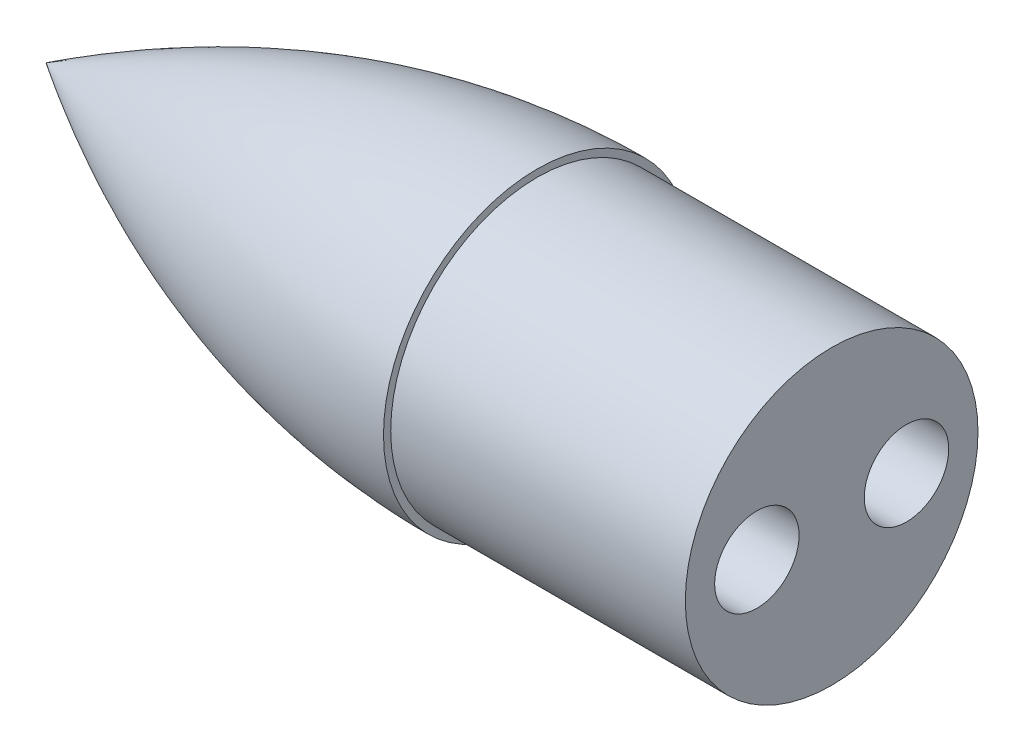
ISO-10303-21;
HEADER;
FILE_DESCRIPTION(('STEP AP214'),'2;1');
FILE_NAME('part.step','',(''),(''),'','','');
FILE_SCHEMA(('AUTOMOTIVE_DESIGN { 1 0 10303 214 1 1 1 1 }'));
ENDSEC;
DATA;
#1=APPLICATION_CONTEXT('core data for automotive mechanical design processes');
#2=APPLICATION_PROTOCOL_DEFINITION('international standard','automotive_design',2000,#1);
#3=PRODUCT_CONTEXT('',#1,'mechanical');
#4=PRODUCT('Part','Part','',(#3));
#5=PRODUCT_RELATED_PRODUCT_CATEGORY('part','',(#4));
#6=PRODUCT_DEFINITION_FORMATION('','',#4);
#7=PRODUCT_DEFINITION_CONTEXT('part definition',#1,'design');
#8=PRODUCT_DEFINITION('design','',#6,#7);
#9=PRODUCT_DEFINITION_SHAPE('','',#8);
#10=(LENGTH_UNIT() NAMED_UNIT(*) SI_UNIT(.MILLI.,.METRE.));
#11=(NAMED_UNIT(*) PLANE_ANGLE_UNIT() SI_UNIT($,.RADIAN.));
#12=(NAMED_UNIT(*) SI_UNIT($,.STERADIAN.) SOLID_ANGLE_UNIT());
#13=UNCERTAINTY_MEASURE_WITH_UNIT(LENGTH_MEASURE(1.E-05),#10,'distance_accuracy_value','');
#14=(GEOMETRIC_REPRESENTATION_CONTEXT(3) GLOBAL_UNCERTAINTY_ASSIGNED_CONTEXT((#13)) GLOBAL_UNIT_ASSIGNED_CONTEXT((#10,
#11,#12)) REPRESENTATION_CONTEXT('',''));
#15=CARTESIAN_POINT('',(0.,0.,0.));
#16=DIRECTION('',(0.,0.,1.));
#17=DIRECTION('',(1.,0.,0.));
#18=AXIS2_PLACEMENT_3D('',#15,#16,#17);
#19=CARTESIAN_POINT('',(126.999999998147,39.7129000005503,0.));
#20=CARTESIAN_POINT('',(63.4999999986337,39.7128999996959,0.));
#21=CARTESIAN_POINT('',(-8.80002667957847E-10,-5.50345793243201E-10,0.));
#22=B_SPLINE_CURVE_WITH_KNOTS('',2,(#19,#20,#21),.UNSPECIFIED.,.F.,.F.,(3,3),
(0.0748794844436661,0.91589813493239),.UNSPECIFIED.);
#23=CARTESIAN_POINT('',(-7.0399762408524E-10,-4.40280190777687E-10,0.));
#24=DIRECTION('',(-1.,0.,0.));
#25=AXIS1_PLACEMENT('',#23,#24);
#26=SURFACE_OF_REVOLUTION('',#22,#25);
#27=CARTESIAN_POINT('',(-7.0399762408524E-10,-4.40280190777687E-10,0.));
#28=VERTEX_POINT('',#27);
#29=VERTEX_LOOP('',#28);
#30=FACE_BOUND('',#29,.T.);
#31=CARTESIAN_POINT('',(126.999999998421,-4.40280190777687E-10,0.));
#32=DIRECTION('',(-1.,0.,0.));
#33=DIRECTION('',(0.,0.,1.));
#34=AXIS2_PLACEMENT_3D('',#31,#32,#33);
#35=CIRCLE('',#34,39.7129000009906);
#36=CARTESIAN_POINT('',(126.999999998421,-4.40280190777687E-10,39.7129000009906));
#37=VERTEX_POINT('',#36);
#38=EDGE_CURVE('E56',#37,#37,#35,.T.);
#39=ORIENTED_EDGE('',*,*,#38,.T.);
#40=EDGE_LOOP('',(#39));
#41=FACE_BOUND('',#40,.T.);
#42=ADVANCED_FACE('F48',(#30,#41),#26,.T.);
#43=CARTESIAN_POINT('',(126.999999998421,-4.40280190777687E-10,0.));
#44=DIRECTION('',(-1.,0.,0.));
#45=DIRECTION('',(0.,0.,1.));
#46=AXIS2_PLACEMENT_3D('',#43,#44,#45);
#47=PLANE('',#46);
#48=CARTESIAN_POINT('',(126.999999998421,0.,0.));
#49=DIRECTION('',(-1.,0.,0.));
#50=DIRECTION('',(0.,0.,1.));
#51=AXIS2_PLACEMENT_3D('',#48,#49,#50);
#52=CIRCLE('',#51,37.846);
#53=CARTESIAN_POINT('',(126.999999998421,0.,37.846));
#54=VERTEX_POINT('',#53);
#55=EDGE_CURVE('E12',#54,#54,#52,.F.);
#56=ORIENTED_EDGE('',*,*,#55,.F.);
#57=EDGE_LOOP('',(#56));
#58=FACE_BOUND('',#57,.T.);
#59=ORIENTED_EDGE('',*,*,#38,.F.);
#60=EDGE_LOOP('',(#59));
#61=FACE_BOUND('',#60,.T.);
#62=ADVANCED_FACE('F62',(#58,#61),#47,.F.);
#63=CARTESIAN_POINT('',(177.799999998421,0.,0.));
#64=DIRECTION('',(-1.,0.,0.));
#65=DIRECTION('',(0.,0.,1.));
#66=AXIS2_PLACEMENT_3D('',#63,#64,#65);
#67=CYLINDRICAL_SURFACE('',#66,37.846);
#68=ORIENTED_EDGE('',*,*,#55,.T.);
#69=EDGE_LOOP('',(#68));
#70=FACE_BOUND('',#69,.T.);
#71=CARTESIAN_POINT('',(203.199999998421,0.,0.));
#72=DIRECTION('',(1.,0.,0.));
#73=DIRECTION('',(0.,0.,-1.));
#74=AXIS2_PLACEMENT_3D('',#71,#72,#73);
#75=CIRCLE('',#74,37.846);
#76=CARTESIAN_POINT('',(203.199999998421,0.,-37.846));
#77=VERTEX_POINT('',#76);
#78=EDGE_CURVE('E74',#77,#77,#75,.T.);
#79=ORIENTED_EDGE('',*,*,#78,.F.);
#80=EDGE_LOOP('',(#79));
#81=FACE_BOUND('',#80,.T.);
#82=ADVANCED_FACE('F107',(#70,#81),#67,.T.);
#83=CARTESIAN_POINT('',(203.199999998421,0.,0.));
#84=DIRECTION('',(1.,0.,0.));
#85=DIRECTION('',(0.,0.,-1.));
#86=AXIS2_PLACEMENT_3D('',#83,#84,#85);
#87=PLANE('',#86);
#88=CARTESIAN_POINT('',(203.199999998421,0.,19.347570255536));
#89=DIRECTION('',(1.,0.,0.));
#90=DIRECTION('',(0.,0.,-1.));
#91=AXIS2_PLACEMENT_3D('',#88,#89,#90);
#92=CIRCLE('',#91,10.922);
#93=CARTESIAN_POINT('',(203.199999998421,0.,8.425570255536));
#94=VERTEX_POINT('',#93);
#95=EDGE_CURVE('E82',#94,#94,#92,.F.);
#96=ORIENTED_EDGE('',*,*,#95,.T.);
#97=EDGE_LOOP('',(#96));
#98=FACE_BOUND('',#97,.T.);
#99=CARTESIAN_POINT('',(203.199999998421,0.,-19.347570255536));
#100=DIRECTION('',(1.,0.,0.));
#101=DIRECTION('',(0.,0.,-1.));
#102=AXIS2_PLACEMENT_3D('',#99,#100,#101);
#103=CIRCLE('',#102,10.922);
#104=CARTESIAN_POINT('',(203.199999998421,0.,-30.269570255536));
#105=VERTEX_POINT('',#104);
#106=EDGE_CURVE('E78',#105,#105,#103,.F.);
#107=ORIENTED_EDGE('',*,*,#106,.T.);
#108=EDGE_LOOP('',(#107));
#109=FACE_BOUND('',#108,.T.);
#110=ORIENTED_EDGE('',*,*,#78,.T.);
#111=EDGE_LOOP('',(#110));
#112=FACE_BOUND('',#111,.T.);
#113=ADVANCED_FACE('F88',(#98,#109,#112),#87,.T.);
#114=CARTESIAN_POINT('',(203.199999998421,0.,-19.347570255536));
#115=DIRECTION('',(-1.,0.,0.));
#116=DIRECTION('',(0.,0.,1.));
#117=AXIS2_PLACEMENT_3D('',#114,#115,#116);
#118=CYLINDRICAL_SURFACE('',#117,10.922);
#119=ORIENTED_EDGE('',*,*,#106,.F.);
#120=EDGE_LOOP('',(#119));
#121=FACE_BOUND('',#120,.T.);
#122=CARTESIAN_POINT('',(177.799999998421,0.,-19.347570255536));
#123=DIRECTION('',(1.,0.,0.));
#124=DIRECTION('',(0.,0.,-1.));
#125=AXIS2_PLACEMENT_3D('',#122,#123,#124);
#126=CIRCLE('',#125,10.922);
#127=CARTESIAN_POINT('',(177.799999998421,0.,-30.269570255536));
#128=VERTEX_POINT('',#127);
#129=EDGE_CURVE('E68',#128,#128,#126,.F.);
#130=ORIENTED_EDGE('',*,*,#129,.T.);
#131=EDGE_LOOP('',(#130));
#132=FACE_BOUND('',#131,.T.);
#133=ADVANCED_FACE('F95',(#121,#132),#118,.F.);
#134=CARTESIAN_POINT('',(203.199999998421,0.,19.347570255536));
#135=DIRECTION('',(-1.,0.,0.));
#136=DIRECTION('',(0.,0.,1.));
#137=AXIS2_PLACEMENT_3D('',#134,#135,#136);
#138=CYLINDRICAL_SURFACE('',#137,10.922);
#139=ORIENTED_EDGE('',*,*,#95,.F.);
#140=EDGE_LOOP('',(#139));
#141=FACE_BOUND('',#140,.T.);
#142=CARTESIAN_POINT('',(177.799999998421,0.,19.347570255536));
#143=DIRECTION('',(1.,0.,0.));
#144=DIRECTION('',(0.,0.,-1.));
#145=AXIS2_PLACEMENT_3D('',#142,#143,#144);
#146=CIRCLE('',#145,10.922);
#147=CARTESIAN_POINT('',(177.799999998421,0.,30.269570255536));
#148=VERTEX_POINT('',#147);
#149=EDGE_CURVE('E52',#148,#148,#146,.F.);
#150=ORIENTED_EDGE('',*,*,#149,.T.);
#151=EDGE_LOOP('',(#150));
#152=FACE_BOUND('',#151,.T.);
#153=ADVANCED_FACE('F91',(#141,#152),#138,.F.);
#154=CARTESIAN_POINT('',(177.799999998421,0.,0.));
#155=DIRECTION('',(0.,-1.,0.));
#156=DIRECTION('',(0.,0.,-1.));
#157=AXIS2_PLACEMENT_3D('',#154,#155,#156);
#158=TOROIDAL_SURFACE('',#157,19.347570255536,10.922);
#159=CARTESIAN_POINT('',(177.799999998421,0.,0.));
#160=DIRECTION('',(0.,-1.,0.));
#161=DIRECTION('',(0.,0.,-1.));
#162=AXIS2_PLACEMENT_3D('',#159,#160,#161);
#163=CIRCLE('',#162,30.269570255536);
#164=EDGE_CURVE('',#148,#128,#163,.T.);
#165=ORIENTED_EDGE('',*,*,#149,.F.);
#166=ORIENTED_EDGE('',*,*,#129,.F.);
#167=ORIENTED_EDGE('',*,*,#164,.T.);
#168=ORIENTED_EDGE('',*,*,#164,.F.);
#169=EDGE_LOOP('',(#165,#167,#166,#168));
#170=FACE_BOUND('',#169,.T.);
#171=ADVANCED_FACE('F94',(#170),#158,.F.);
#172=CLOSED_SHELL('',(#42,#62,#82,#113,#133,#153,#171));
#173=MANIFOLD_SOLID_BREP('B2',#172);
#174=ADVANCED_BREP_SHAPE_REPRESENTATION('',(#18,#173),#14);
#175=SHAPE_DEFINITION_REPRESENTATION(#9,#174);
ENDSEC;
END-ISO-10303-21;
